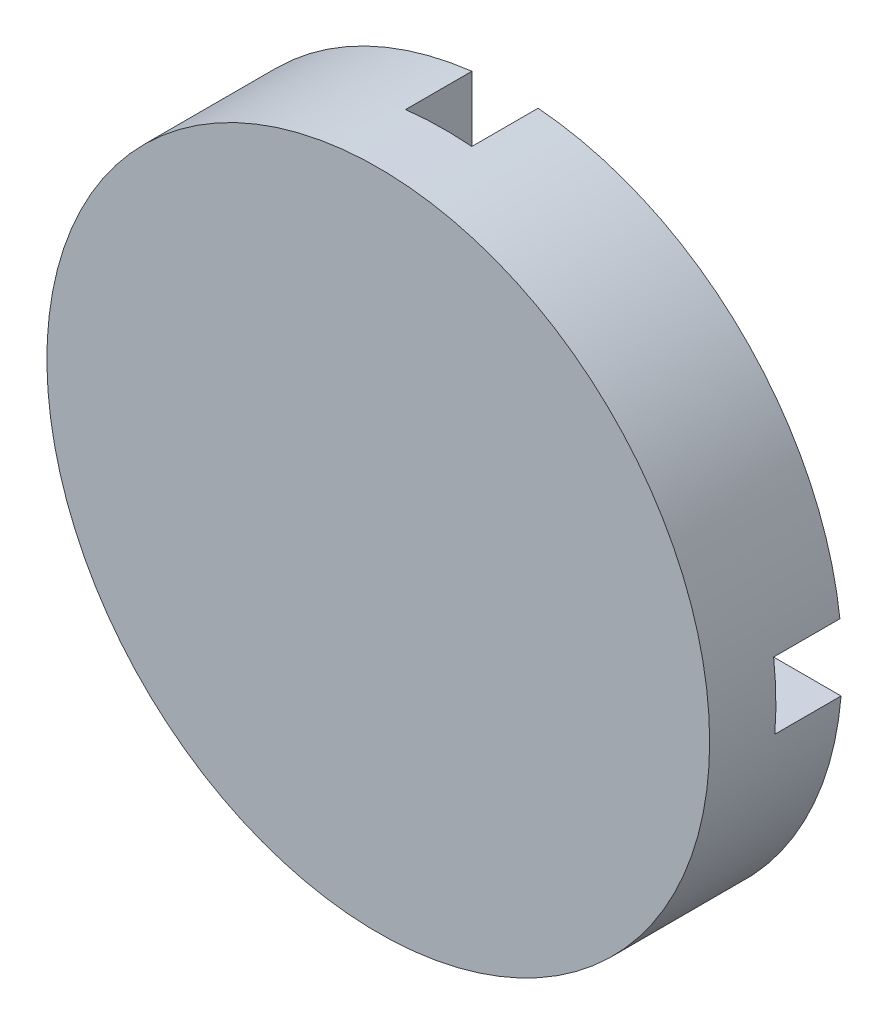
ISO-10303-21;
HEADER;
FILE_DESCRIPTION(('STEP AP214'),'2;1');
FILE_NAME('part.step','',(''),(''),'','','');
FILE_SCHEMA(('AUTOMOTIVE_DESIGN { 1 0 10303 214 1 1 1 1 }'));
ENDSEC;
DATA;
#1=APPLICATION_CONTEXT('core data for automotive mechanical design processes');
#2=APPLICATION_PROTOCOL_DEFINITION('international standard','automotive_design',2000,#1);
#3=PRODUCT_CONTEXT('',#1,'mechanical');
#4=PRODUCT('Part','Part','',(#3));
#5=PRODUCT_RELATED_PRODUCT_CATEGORY('part','',(#4));
#6=PRODUCT_DEFINITION_FORMATION('','',#4);
#7=PRODUCT_DEFINITION_CONTEXT('part definition',#1,'design');
#8=PRODUCT_DEFINITION('design','',#6,#7);
#9=PRODUCT_DEFINITION_SHAPE('','',#8);
#10=(LENGTH_UNIT() NAMED_UNIT(*) SI_UNIT(.MILLI.,.METRE.));
#11=(NAMED_UNIT(*) PLANE_ANGLE_UNIT() SI_UNIT($,.RADIAN.));
#12=(NAMED_UNIT(*) SI_UNIT($,.STERADIAN.) SOLID_ANGLE_UNIT());
#13=UNCERTAINTY_MEASURE_WITH_UNIT(LENGTH_MEASURE(1.E-05),#10,'distance_accuracy_value','');
#14=(GEOMETRIC_REPRESENTATION_CONTEXT(3) GLOBAL_UNCERTAINTY_ASSIGNED_CONTEXT((#13)) GLOBAL_UNIT_ASSIGNED_CONTEXT((#10,
#11,#12)) REPRESENTATION_CONTEXT('',''));
#15=CARTESIAN_POINT('',(0.,0.,0.));
#16=DIRECTION('',(0.,0.,1.));
#17=DIRECTION('',(1.,0.,0.));
#18=AXIS2_PLACEMENT_3D('',#15,#16,#17);
#19=CARTESIAN_POINT('',(0.,0.,10.));
#20=DIRECTION('',(0.,0.,1.));
#21=DIRECTION('',(1.,0.,0.));
#22=AXIS2_PLACEMENT_3D('',#19,#20,#21);
#23=PLANE('',#22);
#24=DIRECTION('',(0.,1.,0.));
#25=VECTOR('',#24,1.);
#26=CARTESIAN_POINT('',(-5.87959814976935,-4.12056385917688,10.));
#27=LINE('',#26,#25);
#28=CARTESIAN_POINT('',(-5.87959814976934,-49.6530998588933,10.));
#29=VERTEX_POINT('',#28);
#30=CARTESIAN_POINT('',(-5.87959814976935,-4.12056385917688,10.));
#31=VERTEX_POINT('',#30);
#32=EDGE_CURVE('E135',#29,#31,#27,.T.);
#33=ORIENTED_EDGE('',*,*,#32,.T.);
#34=DIRECTION('',(-1.,0.,0.));
#35=VECTOR('',#34,1.);
#36=CARTESIAN_POINT('',(-49.8299202636573,-4.12056385917688,10.));
#37=LINE('',#36,#35);
#38=CARTESIAN_POINT('',(-49.8299202636573,-4.12056385917688,10.));
#39=VERTEX_POINT('',#38);
#40=EDGE_CURVE('E144',#31,#39,#37,.T.);
#41=ORIENTED_EDGE('',*,*,#40,.T.);
#42=CARTESIAN_POINT('',(0.,0.,10.));
#43=DIRECTION('',(0.,0.,1.));
#44=DIRECTION('',(1.,0.,0.));
#45=AXIS2_PLACEMENT_3D('',#42,#43,#44);
#46=CIRCLE('',#45,50.);
#47=CARTESIAN_POINT('',(-49.6531190426743,5.87943614082312,10.));
#48=VERTEX_POINT('',#47);
#49=EDGE_CURVE('E235',#48,#39,#46,.T.);
#50=ORIENTED_EDGE('',*,*,#49,.F.);
#51=DIRECTION('',(1.,0.,0.));
#52=VECTOR('',#51,1.);
#53=CARTESIAN_POINT('',(-49.6531190426743,5.87943614082312,10.));
#54=LINE('',#53,#52);
#55=CARTESIAN_POINT('',(-5.87959814976935,5.87943614082312,10.));
#56=VERTEX_POINT('',#55);
#57=EDGE_CURVE('E63',#48,#56,#54,.T.);
#58=ORIENTED_EDGE('',*,*,#57,.T.);
#59=DIRECTION('',(0.,1.,0.));
#60=VECTOR('',#59,1.);
#61=CARTESIAN_POINT('',(-5.87959814976934,49.6530998588933,10.));
#62=LINE('',#61,#60);
#63=CARTESIAN_POINT('',(-5.87959814976934,49.6530998588933,10.));
#64=VERTEX_POINT('',#63);
#65=EDGE_CURVE('E172',#56,#64,#62,.T.);
#66=ORIENTED_EDGE('',*,*,#65,.T.);
#67=CARTESIAN_POINT('',(4.12040185023066,49.8299336603273,10.));
#68=VERTEX_POINT('',#67);
#69=EDGE_CURVE('E231',#68,#64,#46,.T.);
#70=ORIENTED_EDGE('',*,*,#69,.F.);
#71=DIRECTION('',(0.,-1.,0.));
#72=VECTOR('',#71,1.);
#73=CARTESIAN_POINT('',(4.12040185023066,49.8299336603273,10.));
#74=LINE('',#73,#72);
#75=CARTESIAN_POINT('',(4.12040185023066,5.87943614082312,10.));
#76=VERTEX_POINT('',#75);
#77=EDGE_CURVE('E240',#68,#76,#74,.T.);
#78=ORIENTED_EDGE('',*,*,#77,.T.);
#79=DIRECTION('',(1.,0.,0.));
#80=VECTOR('',#79,1.);
#81=CARTESIAN_POINT('',(4.12040185023066,5.87943614082312,10.));
#82=LINE('',#81,#80);
#83=CARTESIAN_POINT('',(49.6531190426743,5.87943614082312,10.));
#84=VERTEX_POINT('',#83);
#85=EDGE_CURVE('E236',#76,#84,#82,.T.);
#86=ORIENTED_EDGE('',*,*,#85,.T.);
#87=CARTESIAN_POINT('',(49.8299202636573,-4.12056385917689,10.));
#88=VERTEX_POINT('',#87);
#89=EDGE_CURVE('E225',#88,#84,#46,.T.);
#90=ORIENTED_EDGE('',*,*,#89,.F.);
#91=DIRECTION('',(-1.,0.,0.));
#92=VECTOR('',#91,1.);
#93=CARTESIAN_POINT('',(4.12040185023065,-4.12056385917688,10.));
#94=LINE('',#93,#92);
#95=CARTESIAN_POINT('',(4.12040185023065,-4.12056385917688,10.));
#96=VERTEX_POINT('',#95);
#97=EDGE_CURVE('E197',#88,#96,#94,.T.);
#98=ORIENTED_EDGE('',*,*,#97,.T.);
#99=DIRECTION('',(0.,-1.,0.));
#100=VECTOR('',#99,1.);
#101=CARTESIAN_POINT('',(4.12040185023065,-4.12056385917688,10.));
#102=LINE('',#101,#100);
#103=CARTESIAN_POINT('',(4.12040185023066,-49.8299336603273,10.));
#104=VERTEX_POINT('',#103);
#105=EDGE_CURVE('E201',#96,#104,#102,.T.);
#106=ORIENTED_EDGE('',*,*,#105,.T.);
#107=EDGE_CURVE('E153',#29,#104,#46,.T.);
#108=ORIENTED_EDGE('',*,*,#107,.F.);
#109=EDGE_LOOP('',(#33,#41,#50,#58,#66,#70,#78,#86,#90,#98,#106,#108));
#110=FACE_BOUND('',#109,.T.);
#111=ADVANCED_FACE('F39',(#110),#23,.F.);
#112=CARTESIAN_POINT('',(4.12040185023066,5.87943614082312,10.));
#113=DIRECTION('',(0.,1.,0.));
#114=DIRECTION('',(0.,0.,1.));
#115=AXIS2_PLACEMENT_3D('',#112,#113,#114);
#116=PLANE('',#115);
#117=DIRECTION('',(1.,0.,0.));
#118=VECTOR('',#117,1.);
#119=CARTESIAN_POINT('',(4.12040185023066,5.87943614082312,0.));
#120=LINE('',#119,#118);
#121=CARTESIAN_POINT('',(4.12040185023066,5.87943614082312,0.));
#122=VERTEX_POINT('',#121);
#123=CARTESIAN_POINT('',(49.6531190426743,5.87943614082312,0.));
#124=VERTEX_POINT('',#123);
#125=EDGE_CURVE('E230',#122,#124,#120,.T.);
#126=ORIENTED_EDGE('',*,*,#125,.T.);
#127=DIRECTION('',(0.,0.,-1.));
#128=VECTOR('',#127,1.);
#129=CARTESIAN_POINT('',(49.6531190426743,5.87943614082312,10.));
#130=LINE('',#129,#128);
#131=EDGE_CURVE('E11',#84,#124,#130,.T.);
#132=ORIENTED_EDGE('',*,*,#131,.F.);
#133=ORIENTED_EDGE('',*,*,#85,.F.);
#134=DIRECTION('',(0.,0.,-1.));
#135=VECTOR('',#134,1.);
#136=CARTESIAN_POINT('',(4.12040185023066,5.87943614082312,10.));
#137=LINE('',#136,#135);
#138=EDGE_CURVE('E245',#76,#122,#137,.T.);
#139=ORIENTED_EDGE('',*,*,#138,.T.);
#140=EDGE_LOOP('',(#126,#132,#133,#139));
#141=FACE_BOUND('',#140,.T.);
#142=ADVANCED_FACE('F41',(#141),#116,.F.);
#143=CARTESIAN_POINT('',(0.,0.,10.));
#144=DIRECTION('',(0.,0.,-1.));
#145=DIRECTION('',(-1.,0.,0.));
#146=AXIS2_PLACEMENT_3D('',#143,#144,#145);
#147=CYLINDRICAL_SURFACE('',#146,50.);
#148=CARTESIAN_POINT('',(0.,0.,0.));
#149=DIRECTION('',(0.,0.,1.));
#150=DIRECTION('',(1.,0.,0.));
#151=AXIS2_PLACEMENT_3D('',#148,#149,#150);
#152=CIRCLE('',#151,50.);
#153=CARTESIAN_POINT('',(4.12040185023066,49.8299336603273,0.));
#154=VERTEX_POINT('',#153);
#155=EDGE_CURVE('E249',#124,#154,#152,.T.);
#156=ORIENTED_EDGE('',*,*,#155,.T.);
#157=DIRECTION('',(0.,0.,-1.));
#158=VECTOR('',#157,1.);
#159=CARTESIAN_POINT('',(4.12040185023066,49.8299336603273,10.));
#160=LINE('',#159,#158);
#161=EDGE_CURVE('E48',#68,#154,#160,.T.);
#162=ORIENTED_EDGE('',*,*,#161,.F.);
#163=ORIENTED_EDGE('',*,*,#69,.T.);
#164=DIRECTION('',(0.,0.,-1.));
#165=VECTOR('',#164,1.);
#166=CARTESIAN_POINT('',(-5.87959814976934,49.6530998588933,10.));
#167=LINE('',#166,#165);
#168=CARTESIAN_POINT('',(-5.87959814976934,49.6530998588933,0.));
#169=VERTEX_POINT('',#168);
#170=EDGE_CURVE('E188',#64,#169,#167,.T.);
#171=ORIENTED_EDGE('',*,*,#170,.T.);
#172=CARTESIAN_POINT('',(0.,0.,0.));
#173=DIRECTION('',(0.,0.,1.));
#174=DIRECTION('',(1.,0.,0.));
#175=AXIS2_PLACEMENT_3D('',#172,#173,#174);
#176=CIRCLE('',#175,50.);
#177=CARTESIAN_POINT('',(-49.6531190426743,5.87943614082311,0.));
#178=VERTEX_POINT('',#177);
#179=EDGE_CURVE('E173',#169,#178,#176,.T.);
#180=ORIENTED_EDGE('',*,*,#179,.T.);
#181=DIRECTION('',(0.,0.,-1.));
#182=VECTOR('',#181,1.);
#183=CARTESIAN_POINT('',(-49.6531190426743,5.87943614082311,10.));
#184=LINE('',#183,#182);
#185=EDGE_CURVE('E177',#48,#178,#184,.T.);
#186=ORIENTED_EDGE('',*,*,#185,.F.);
#187=ORIENTED_EDGE('',*,*,#49,.T.);
#188=DIRECTION('',(0.,0.,-1.));
#189=VECTOR('',#188,1.);
#190=CARTESIAN_POINT('',(-49.8299202636573,-4.12056385917688,10.));
#191=LINE('',#190,#189);
#192=CARTESIAN_POINT('',(-49.8299202636573,-4.12056385917688,0.));
#193=VERTEX_POINT('',#192);
#194=EDGE_CURVE('E141',#39,#193,#191,.T.);
#195=ORIENTED_EDGE('',*,*,#194,.T.);
#196=CARTESIAN_POINT('',(0.,0.,0.));
#197=DIRECTION('',(0.,0.,1.));
#198=DIRECTION('',(1.,0.,0.));
#199=AXIS2_PLACEMENT_3D('',#196,#197,#198);
#200=CIRCLE('',#199,50.);
#201=CARTESIAN_POINT('',(-5.87959814976934,-49.6530998588933,0.));
#202=VERTEX_POINT('',#201);
#203=EDGE_CURVE('E160',#193,#202,#200,.T.);
#204=ORIENTED_EDGE('',*,*,#203,.T.);
#205=DIRECTION('',(0.,0.,-1.));
#206=VECTOR('',#205,1.);
#207=CARTESIAN_POINT('',(-5.87959814976934,-49.6530998588933,10.));
#208=LINE('',#207,#206);
#209=EDGE_CURVE('E55',#29,#202,#208,.T.);
#210=ORIENTED_EDGE('',*,*,#209,.F.);
#211=ORIENTED_EDGE('',*,*,#107,.T.);
#212=DIRECTION('',(0.,0.,-1.));
#213=VECTOR('',#212,1.);
#214=CARTESIAN_POINT('',(4.12040185023066,-49.8299336603273,10.));
#215=LINE('',#214,#213);
#216=CARTESIAN_POINT('',(4.12040185023066,-49.8299336603273,0.));
#217=VERTEX_POINT('',#216);
#218=EDGE_CURVE('E217',#104,#217,#215,.T.);
#219=ORIENTED_EDGE('',*,*,#218,.T.);
#220=CARTESIAN_POINT('',(0.,0.,0.));
#221=DIRECTION('',(0.,0.,1.));
#222=DIRECTION('',(1.,0.,0.));
#223=AXIS2_PLACEMENT_3D('',#220,#221,#222);
#224=CIRCLE('',#223,50.);
#225=CARTESIAN_POINT('',(49.8299202636573,-4.12056385917689,0.));
#226=VERTEX_POINT('',#225);
#227=EDGE_CURVE('E202',#217,#226,#224,.T.);
#228=ORIENTED_EDGE('',*,*,#227,.T.);
#229=DIRECTION('',(0.,0.,-1.));
#230=VECTOR('',#229,1.);
#231=CARTESIAN_POINT('',(49.8299202636573,-4.12056385917689,10.));
#232=LINE('',#231,#230);
#233=EDGE_CURVE('E205',#88,#226,#232,.T.);
#234=ORIENTED_EDGE('',*,*,#233,.F.);
#235=ORIENTED_EDGE('',*,*,#89,.T.);
#236=ORIENTED_EDGE('',*,*,#131,.T.);
#237=EDGE_LOOP('',(#156,#162,#163,#171,#180,#186,#187,#195,#204,#210,#211,#219,#228,#234,#235,#236));
#238=FACE_BOUND('',#237,.T.);
#239=CARTESIAN_POINT('',(0.,0.,20.));
#240=DIRECTION('',(0.,0.,1.));
#241=DIRECTION('',(1.,0.,0.));
#242=AXIS2_PLACEMENT_3D('',#239,#240,#241);
#243=CIRCLE('',#242,50.);
#244=CARTESIAN_POINT('',(50.,0.,20.));
#245=VERTEX_POINT('',#244);
#246=EDGE_CURVE('E226',#245,#245,#243,.T.);
#247=ORIENTED_EDGE('',*,*,#246,.F.);
#248=EDGE_LOOP('',(#247));
#249=FACE_BOUND('',#248,.T.);
#250=ADVANCED_FACE('F270',(#238,#249),#147,.T.);
#251=CARTESIAN_POINT('',(4.12040185023066,49.8299336603273,10.));
#252=DIRECTION('',(1.,0.,0.));
#253=DIRECTION('',(0.,0.,-1.));
#254=AXIS2_PLACEMENT_3D('',#251,#252,#253);
#255=PLANE('',#254);
#256=DIRECTION('',(0.,-1.,0.));
#257=VECTOR('',#256,1.);
#258=CARTESIAN_POINT('',(4.12040185023066,49.8299336603273,0.));
#259=LINE('',#258,#257);
#260=EDGE_CURVE('E241',#154,#122,#259,.T.);
#261=ORIENTED_EDGE('',*,*,#260,.T.);
#262=ORIENTED_EDGE('',*,*,#138,.F.);
#263=ORIENTED_EDGE('',*,*,#77,.F.);
#264=ORIENTED_EDGE('',*,*,#161,.T.);
#265=EDGE_LOOP('',(#261,#262,#263,#264));
#266=FACE_BOUND('',#265,.T.);
#267=ADVANCED_FACE('F261',(#266),#255,.F.);
#268=CARTESIAN_POINT('',(0.,0.,0.));
#269=DIRECTION('',(0.,0.,1.));
#270=DIRECTION('',(1.,0.,0.));
#271=AXIS2_PLACEMENT_3D('',#268,#269,#270);
#272=PLANE('',#271);
#273=ORIENTED_EDGE('',*,*,#125,.F.);
#274=ORIENTED_EDGE('',*,*,#260,.F.);
#275=ORIENTED_EDGE('',*,*,#155,.F.);
#276=EDGE_LOOP('',(#273,#274,#275));
#277=FACE_BOUND('',#276,.T.);
#278=ADVANCED_FACE('F266',(#277),#272,.F.);
#279=CARTESIAN_POINT('',(0.,0.,20.));
#280=DIRECTION('',(0.,0.,1.));
#281=DIRECTION('',(1.,0.,0.));
#282=AXIS2_PLACEMENT_3D('',#279,#280,#281);
#283=PLANE('',#282);
#284=ORIENTED_EDGE('',*,*,#246,.T.);
#285=EDGE_LOOP('',(#284));
#286=FACE_BOUND('',#285,.T.);
#287=ADVANCED_FACE('F308',(#286),#283,.T.);
#288=CARTESIAN_POINT('',(4.12040185023065,-4.12056385917688,10.));
#289=DIRECTION('',(0.,-1.,0.));
#290=DIRECTION('',(0.,0.,-1.));
#291=AXIS2_PLACEMENT_3D('',#288,#289,#290);
#292=PLANE('',#291);
#293=DIRECTION('',(-1.,0.,0.));
#294=VECTOR('',#293,1.);
#295=CARTESIAN_POINT('',(4.12040185023065,-4.12056385917688,0.));
#296=LINE('',#295,#294);
#297=CARTESIAN_POINT('',(4.12040185023065,-4.12056385917688,0.));
#298=VERTEX_POINT('',#297);
#299=EDGE_CURVE('E196',#226,#298,#296,.T.);
#300=ORIENTED_EDGE('',*,*,#299,.T.);
#301=DIRECTION('',(0.,0.,-1.));
#302=VECTOR('',#301,1.);
#303=CARTESIAN_POINT('',(4.12040185023065,-4.12056385917688,10.));
#304=LINE('',#303,#302);
#305=EDGE_CURVE('E221',#96,#298,#304,.T.);
#306=ORIENTED_EDGE('',*,*,#305,.F.);
#307=ORIENTED_EDGE('',*,*,#97,.F.);
#308=ORIENTED_EDGE('',*,*,#233,.T.);
#309=EDGE_LOOP('',(#300,#306,#307,#308));
#310=FACE_BOUND('',#309,.T.);
#311=ADVANCED_FACE('F284',(#310),#292,.F.);
#312=CARTESIAN_POINT('',(4.12040185023065,-4.12056385917688,10.));
#313=DIRECTION('',(1.,0.,0.));
#314=DIRECTION('',(0.,1.,0.));
#315=AXIS2_PLACEMENT_3D('',#312,#313,#314);
#316=PLANE('',#315);
#317=DIRECTION('',(0.,-1.,0.));
#318=VECTOR('',#317,1.);
#319=CARTESIAN_POINT('',(4.12040185023065,-4.12056385917688,0.));
#320=LINE('',#319,#318);
#321=EDGE_CURVE('E209',#298,#217,#320,.T.);
#322=ORIENTED_EDGE('',*,*,#321,.T.);
#323=ORIENTED_EDGE('',*,*,#218,.F.);
#324=ORIENTED_EDGE('',*,*,#105,.F.);
#325=ORIENTED_EDGE('',*,*,#305,.T.);
#326=EDGE_LOOP('',(#322,#323,#324,#325));
#327=FACE_BOUND('',#326,.T.);
#328=ADVANCED_FACE('F287',(#327),#316,.F.);
#329=CARTESIAN_POINT('',(0.,0.,0.));
#330=DIRECTION('',(0.,0.,1.));
#331=DIRECTION('',(1.,0.,0.));
#332=AXIS2_PLACEMENT_3D('',#329,#330,#331);
#333=PLANE('',#332);
#334=ORIENTED_EDGE('',*,*,#299,.F.);
#335=ORIENTED_EDGE('',*,*,#227,.F.);
#336=ORIENTED_EDGE('',*,*,#321,.F.);
#337=EDGE_LOOP('',(#334,#335,#336));
#338=FACE_BOUND('',#337,.T.);
#339=ADVANCED_FACE('F291',(#338),#333,.F.);
#340=CARTESIAN_POINT('',(-49.6531190426743,5.87943614082312,10.));
#341=DIRECTION('',(0.,1.,0.));
#342=DIRECTION('',(0.,0.,1.));
#343=AXIS2_PLACEMENT_3D('',#340,#341,#342);
#344=PLANE('',#343);
#345=DIRECTION('',(1.,0.,0.));
#346=VECTOR('',#345,1.);
#347=CARTESIAN_POINT('',(-49.6531190426743,5.87943614082312,0.));
#348=LINE('',#347,#346);
#349=CARTESIAN_POINT('',(-5.87959814976935,5.87943614082312,0.));
#350=VERTEX_POINT('',#349);
#351=EDGE_CURVE('E169',#178,#350,#348,.T.);
#352=ORIENTED_EDGE('',*,*,#351,.T.);
#353=DIRECTION('',(0.,0.,-1.));
#354=VECTOR('',#353,1.);
#355=CARTESIAN_POINT('',(-5.87959814976935,5.87943614082312,10.));
#356=LINE('',#355,#354);
#357=EDGE_CURVE('E192',#56,#350,#356,.T.);
#358=ORIENTED_EDGE('',*,*,#357,.F.);
#359=ORIENTED_EDGE('',*,*,#57,.F.);
#360=ORIENTED_EDGE('',*,*,#185,.T.);
#361=EDGE_LOOP('',(#352,#358,#359,#360));
#362=FACE_BOUND('',#361,.T.);
#363=ADVANCED_FACE('F277',(#362),#344,.F.);
#364=CARTESIAN_POINT('',(-5.87959814976934,49.6530998588933,10.));
#365=DIRECTION('',(-1.,0.,0.));
#366=DIRECTION('',(0.,-1.,0.));
#367=AXIS2_PLACEMENT_3D('',#364,#365,#366);
#368=PLANE('',#367);
#369=DIRECTION('',(0.,1.,0.));
#370=VECTOR('',#369,1.);
#371=CARTESIAN_POINT('',(-5.87959814976934,49.6530998588933,0.));
#372=LINE('',#371,#370);
#373=EDGE_CURVE('E181',#350,#169,#372,.T.);
#374=ORIENTED_EDGE('',*,*,#373,.T.);
#375=ORIENTED_EDGE('',*,*,#170,.F.);
#376=ORIENTED_EDGE('',*,*,#65,.F.);
#377=ORIENTED_EDGE('',*,*,#357,.T.);
#378=EDGE_LOOP('',(#374,#375,#376,#377));
#379=FACE_BOUND('',#378,.T.);
#380=ADVANCED_FACE('F298',(#379),#368,.F.);
#381=CARTESIAN_POINT('',(0.,0.,0.));
#382=DIRECTION('',(0.,0.,1.));
#383=DIRECTION('',(1.,0.,0.));
#384=AXIS2_PLACEMENT_3D('',#381,#382,#383);
#385=PLANE('',#384);
#386=ORIENTED_EDGE('',*,*,#351,.F.);
#387=ORIENTED_EDGE('',*,*,#179,.F.);
#388=ORIENTED_EDGE('',*,*,#373,.F.);
#389=EDGE_LOOP('',(#386,#387,#388));
#390=FACE_BOUND('',#389,.T.);
#391=ADVANCED_FACE('F276',(#390),#385,.F.);
#392=CARTESIAN_POINT('',(-5.87959814976935,-4.12056385917688,10.));
#393=DIRECTION('',(-1.,0.,0.));
#394=DIRECTION('',(0.,-1.,0.));
#395=AXIS2_PLACEMENT_3D('',#392,#393,#394);
#396=PLANE('',#395);
#397=DIRECTION('',(0.,1.,0.));
#398=VECTOR('',#397,1.);
#399=CARTESIAN_POINT('',(-5.87959814976935,-4.12056385917688,0.));
#400=LINE('',#399,#398);
#401=CARTESIAN_POINT('',(-5.87959814976935,-4.12056385917688,0.));
#402=VERTEX_POINT('',#401);
#403=EDGE_CURVE('E137',#202,#402,#400,.T.);
#404=ORIENTED_EDGE('',*,*,#403,.T.);
#405=DIRECTION('',(0.,0.,-1.));
#406=VECTOR('',#405,1.);
#407=CARTESIAN_POINT('',(-5.87959814976935,-4.12056385917688,10.));
#408=LINE('',#407,#406);
#409=EDGE_CURVE('E131',#31,#402,#408,.T.);
#410=ORIENTED_EDGE('',*,*,#409,.F.);
#411=ORIENTED_EDGE('',*,*,#32,.F.);
#412=ORIENTED_EDGE('',*,*,#209,.T.);
#413=EDGE_LOOP('',(#404,#410,#411,#412));
#414=FACE_BOUND('',#413,.T.);
#415=ADVANCED_FACE('F133',(#414),#396,.F.);
#416=CARTESIAN_POINT('',(-49.8299202636573,-4.12056385917688,10.));
#417=DIRECTION('',(0.,-1.,0.));
#418=DIRECTION('',(0.,0.,-1.));
#419=AXIS2_PLACEMENT_3D('',#416,#417,#418);
#420=PLANE('',#419);
#421=DIRECTION('',(-1.,0.,0.));
#422=VECTOR('',#421,1.);
#423=CARTESIAN_POINT('',(-49.8299202636573,-4.12056385917688,0.));
#424=LINE('',#423,#422);
#425=EDGE_CURVE('E155',#402,#193,#424,.T.);
#426=ORIENTED_EDGE('',*,*,#425,.T.);
#427=ORIENTED_EDGE('',*,*,#194,.F.);
#428=ORIENTED_EDGE('',*,*,#40,.F.);
#429=ORIENTED_EDGE('',*,*,#409,.T.);
#430=EDGE_LOOP('',(#426,#427,#428,#429));
#431=FACE_BOUND('',#430,.T.);
#432=ADVANCED_FACE('F145',(#431),#420,.F.);
#433=CARTESIAN_POINT('',(0.,0.,0.));
#434=DIRECTION('',(0.,0.,1.));
#435=DIRECTION('',(1.,0.,0.));
#436=AXIS2_PLACEMENT_3D('',#433,#434,#435);
#437=PLANE('',#436);
#438=ORIENTED_EDGE('',*,*,#203,.F.);
#439=ORIENTED_EDGE('',*,*,#425,.F.);
#440=ORIENTED_EDGE('',*,*,#403,.F.);
#441=EDGE_LOOP('',(#438,#439,#440));
#442=FACE_BOUND('',#441,.T.);
#443=ADVANCED_FACE('F386',(#442),#437,.F.);
#444=CLOSED_SHELL('',(#111,#142,#250,#267,#278,#287,#311,#328,#339,#363,#380,#391,#415,#432,#443));
#445=MANIFOLD_SOLID_BREP('B2',#444);
#446=ADVANCED_BREP_SHAPE_REPRESENTATION('',(#18,#445),#14);
#447=SHAPE_DEFINITION_REPRESENTATION(#9,#446);
ENDSEC;
END-ISO-10303-21;
